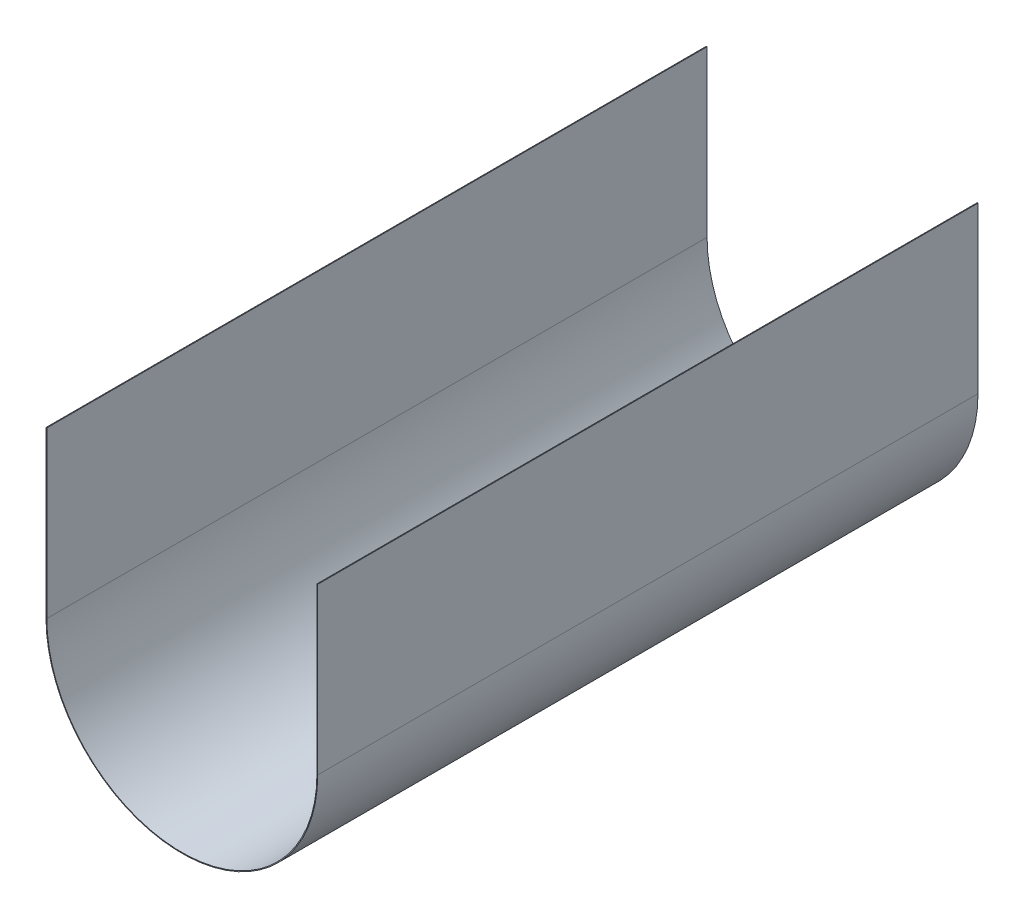
ISO-10303-21;
HEADER;
FILE_DESCRIPTION(('STEP AP214'),'2;1');
FILE_NAME('part.step','',(''),(''),'','','');
FILE_SCHEMA(('AUTOMOTIVE_DESIGN { 1 0 10303 214 1 1 1 1 }'));
ENDSEC;
DATA;
#1=APPLICATION_CONTEXT('core data for automotive mechanical design processes');
#2=APPLICATION_PROTOCOL_DEFINITION('international standard','automotive_design',2000,#1);
#3=PRODUCT_CONTEXT('',#1,'mechanical');
#4=PRODUCT('Part','Part','',(#3));
#5=PRODUCT_RELATED_PRODUCT_CATEGORY('part','',(#4));
#6=PRODUCT_DEFINITION_FORMATION('','',#4);
#7=PRODUCT_DEFINITION_CONTEXT('part definition',#1,'design');
#8=PRODUCT_DEFINITION('design','',#6,#7);
#9=PRODUCT_DEFINITION_SHAPE('','',#8);
#10=(LENGTH_UNIT() NAMED_UNIT(*) SI_UNIT(.MILLI.,.METRE.));
#11=(NAMED_UNIT(*) PLANE_ANGLE_UNIT() SI_UNIT($,.RADIAN.));
#12=(NAMED_UNIT(*) SI_UNIT($,.STERADIAN.) SOLID_ANGLE_UNIT());
#13=UNCERTAINTY_MEASURE_WITH_UNIT(LENGTH_MEASURE(1.E-05),#10,'distance_accuracy_value','');
#14=(GEOMETRIC_REPRESENTATION_CONTEXT(3) GLOBAL_UNCERTAINTY_ASSIGNED_CONTEXT((#13)) GLOBAL_UNIT_ASSIGNED_CONTEXT((#10,
#11,#12)) REPRESENTATION_CONTEXT('',''));
#15=CARTESIAN_POINT('',(0.,0.,0.));
#16=DIRECTION('',(0.,0.,1.));
#17=DIRECTION('',(1.,0.,0.));
#18=AXIS2_PLACEMENT_3D('',#15,#16,#17);
#19=CARTESIAN_POINT('',(-344.9,0.,1676.4));
#20=DIRECTION('',(-1.,0.,0.));
#21=DIRECTION('',(0.,0.,1.));
#22=AXIS2_PLACEMENT_3D('',#19,#20,#21);
#23=PLANE('',#22);
#24=DIRECTION('',(0.,1.,0.));
#25=VECTOR('',#24,1.);
#26=CARTESIAN_POINT('',(-344.9,0.,0.));
#27=LINE('',#26,#25);
#28=CARTESIAN_POINT('',(-344.9,0.,0.));
#29=VERTEX_POINT('',#28);
#30=CARTESIAN_POINT('',(-344.9,419.1,0.));
#31=VERTEX_POINT('',#30);
#32=EDGE_CURVE('E133',#29,#31,#27,.T.);
#33=ORIENTED_EDGE('',*,*,#32,.F.);
#34=DIRECTION('',(0.,0.,-1.));
#35=VECTOR('',#34,1.);
#36=CARTESIAN_POINT('',(-344.9,0.,1676.4));
#37=LINE('',#36,#35);
#38=CARTESIAN_POINT('',(-344.9,0.,1676.4));
#39=VERTEX_POINT('',#38);
#40=EDGE_CURVE('E11',#39,#29,#37,.T.);
#41=ORIENTED_EDGE('',*,*,#40,.F.);
#42=DIRECTION('',(0.,1.,0.));
#43=VECTOR('',#42,1.);
#44=CARTESIAN_POINT('',(-344.9,0.,1676.4));
#45=LINE('',#44,#43);
#46=CARTESIAN_POINT('',(-344.9,419.1,1676.4));
#47=VERTEX_POINT('',#46);
#48=EDGE_CURVE('E151',#39,#47,#45,.T.);
#49=ORIENTED_EDGE('',*,*,#48,.T.);
#50=DIRECTION('',(0.,0.,-1.));
#51=VECTOR('',#50,1.);
#52=CARTESIAN_POINT('',(-344.9,419.1,1676.4));
#53=LINE('',#52,#51);
#54=EDGE_CURVE('E88',#47,#31,#53,.T.);
#55=ORIENTED_EDGE('',*,*,#54,.T.);
#56=EDGE_LOOP('',(#33,#41,#49,#55));
#57=FACE_BOUND('',#56,.T.);
#58=ADVANCED_FACE('F38',(#57),#23,.T.);
#59=CARTESIAN_POINT('',(0.,0.,1676.4));
#60=DIRECTION('',(0.,0.,-1.));
#61=DIRECTION('',(-1.,0.,0.));
#62=AXIS2_PLACEMENT_3D('',#59,#60,#61);
#63=CYLINDRICAL_SURFACE('',#62,344.9);
#64=CARTESIAN_POINT('',(0.,0.,0.));
#65=DIRECTION('',(0.,0.,1.));
#66=DIRECTION('',(1.,0.,0.));
#67=AXIS2_PLACEMENT_3D('',#64,#65,#66);
#68=CIRCLE('',#67,344.9);
#69=CARTESIAN_POINT('',(344.9,0.,0.));
#70=VERTEX_POINT('',#69);
#71=EDGE_CURVE('E136',#29,#70,#68,.T.);
#72=ORIENTED_EDGE('',*,*,#71,.T.);
#73=DIRECTION('',(0.,0.,-1.));
#74=VECTOR('',#73,1.);
#75=CARTESIAN_POINT('',(344.9,0.,1676.4));
#76=LINE('',#75,#74);
#77=CARTESIAN_POINT('',(344.9,0.,1676.4));
#78=VERTEX_POINT('',#77);
#79=EDGE_CURVE('E46',#78,#70,#76,.T.);
#80=ORIENTED_EDGE('',*,*,#79,.F.);
#81=CARTESIAN_POINT('',(0.,0.,1676.4));
#82=DIRECTION('',(0.,0.,1.));
#83=DIRECTION('',(1.,0.,0.));
#84=AXIS2_PLACEMENT_3D('',#81,#82,#83);
#85=CIRCLE('',#84,344.9);
#86=EDGE_CURVE('E175',#39,#78,#85,.T.);
#87=ORIENTED_EDGE('',*,*,#86,.F.);
#88=ORIENTED_EDGE('',*,*,#40,.T.);
#89=EDGE_LOOP('',(#72,#80,#87,#88));
#90=FACE_BOUND('',#89,.T.);
#91=ADVANCED_FACE('F179',(#90),#63,.T.);
#92=CARTESIAN_POINT('',(344.9,0.,1676.4));
#93=DIRECTION('',(-1.,0.,0.));
#94=DIRECTION('',(0.,0.,1.));
#95=AXIS2_PLACEMENT_3D('',#92,#93,#94);
#96=PLANE('',#95);
#97=DIRECTION('',(0.,1.,0.));
#98=VECTOR('',#97,1.);
#99=CARTESIAN_POINT('',(344.9,0.,0.));
#100=LINE('',#99,#98);
#101=CARTESIAN_POINT('',(344.9,419.1,0.));
#102=VERTEX_POINT('',#101);
#103=EDGE_CURVE('E138',#70,#102,#100,.T.);
#104=ORIENTED_EDGE('',*,*,#103,.T.);
#105=DIRECTION('',(0.,0.,-1.));
#106=VECTOR('',#105,1.);
#107=CARTESIAN_POINT('',(344.9,419.1,1676.4));
#108=LINE('',#107,#106);
#109=CARTESIAN_POINT('',(344.9,419.1,1676.4));
#110=VERTEX_POINT('',#109);
#111=EDGE_CURVE('E157',#110,#102,#108,.T.);
#112=ORIENTED_EDGE('',*,*,#111,.F.);
#113=DIRECTION('',(0.,1.,0.));
#114=VECTOR('',#113,1.);
#115=CARTESIAN_POINT('',(344.9,0.,1676.4));
#116=LINE('',#115,#114);
#117=EDGE_CURVE('E165',#78,#110,#116,.T.);
#118=ORIENTED_EDGE('',*,*,#117,.F.);
#119=ORIENTED_EDGE('',*,*,#79,.T.);
#120=EDGE_LOOP('',(#104,#112,#118,#119));
#121=FACE_BOUND('',#120,.T.);
#122=ADVANCED_FACE('F163',(#121),#96,.F.);
#123=CARTESIAN_POINT('',(0.,419.1,1676.4));
#124=DIRECTION('',(0.,1.,0.));
#125=DIRECTION('',(0.,0.,1.));
#126=AXIS2_PLACEMENT_3D('',#123,#124,#125);
#127=PLANE('',#126);
#128=DIRECTION('',(1.,0.,0.));
#129=VECTOR('',#128,1.);
#130=CARTESIAN_POINT('',(0.,419.1,0.));
#131=LINE('',#130,#129);
#132=CARTESIAN_POINT('',(342.9,419.1,0.));
#133=VERTEX_POINT('',#132);
#134=EDGE_CURVE('E141',#133,#102,#131,.T.);
#135=ORIENTED_EDGE('',*,*,#134,.F.);
#136=DIRECTION('',(0.,0.,-1.));
#137=VECTOR('',#136,1.);
#138=CARTESIAN_POINT('',(342.9,419.1,1676.4));
#139=LINE('',#138,#137);
#140=CARTESIAN_POINT('',(342.9,419.1,1676.4));
#141=VERTEX_POINT('',#140);
#142=EDGE_CURVE('E155',#141,#133,#139,.T.);
#143=ORIENTED_EDGE('',*,*,#142,.F.);
#144=DIRECTION('',(1.,0.,0.));
#145=VECTOR('',#144,1.);
#146=CARTESIAN_POINT('',(0.,419.1,1676.4));
#147=LINE('',#146,#145);
#148=EDGE_CURVE('E128',#141,#110,#147,.T.);
#149=ORIENTED_EDGE('',*,*,#148,.T.);
#150=ORIENTED_EDGE('',*,*,#111,.T.);
#151=EDGE_LOOP('',(#135,#143,#149,#150));
#152=FACE_BOUND('',#151,.T.);
#153=ADVANCED_FACE('F173',(#152),#127,.T.);
#154=CARTESIAN_POINT('',(342.9,0.,1676.4));
#155=DIRECTION('',(-1.,0.,0.));
#156=DIRECTION('',(0.,0.,1.));
#157=AXIS2_PLACEMENT_3D('',#154,#155,#156);
#158=PLANE('',#157);
#159=DIRECTION('',(0.,1.,0.));
#160=VECTOR('',#159,1.);
#161=CARTESIAN_POINT('',(342.9,0.,0.));
#162=LINE('',#161,#160);
#163=CARTESIAN_POINT('',(342.9,0.,0.));
#164=VERTEX_POINT('',#163);
#165=EDGE_CURVE('E144',#164,#133,#162,.T.);
#166=ORIENTED_EDGE('',*,*,#165,.F.);
#167=DIRECTION('',(0.,0.,-1.));
#168=VECTOR('',#167,1.);
#169=CARTESIAN_POINT('',(342.9,0.,1676.4));
#170=LINE('',#169,#168);
#171=CARTESIAN_POINT('',(342.9,0.,1676.4));
#172=VERTEX_POINT('',#171);
#173=EDGE_CURVE('E116',#172,#164,#170,.T.);
#174=ORIENTED_EDGE('',*,*,#173,.F.);
#175=DIRECTION('',(0.,1.,0.));
#176=VECTOR('',#175,1.);
#177=CARTESIAN_POINT('',(342.9,0.,1676.4));
#178=LINE('',#177,#176);
#179=EDGE_CURVE('E126',#172,#141,#178,.T.);
#180=ORIENTED_EDGE('',*,*,#179,.T.);
#181=ORIENTED_EDGE('',*,*,#142,.T.);
#182=EDGE_LOOP('',(#166,#174,#180,#181));
#183=FACE_BOUND('',#182,.T.);
#184=ADVANCED_FACE('F189',(#183),#158,.T.);
#185=CARTESIAN_POINT('',(0.,0.,1676.4));
#186=DIRECTION('',(0.,0.,-1.));
#187=DIRECTION('',(-1.,0.,0.));
#188=AXIS2_PLACEMENT_3D('',#185,#186,#187);
#189=CYLINDRICAL_SURFACE('',#188,342.9);
#190=CARTESIAN_POINT('',(0.,0.,0.));
#191=DIRECTION('',(0.,0.,1.));
#192=DIRECTION('',(1.,0.,0.));
#193=AXIS2_PLACEMENT_3D('',#190,#191,#192);
#194=CIRCLE('',#193,342.9);
#195=CARTESIAN_POINT('',(-342.9,0.,0.));
#196=VERTEX_POINT('',#195);
#197=EDGE_CURVE('E115',#196,#164,#194,.T.);
#198=ORIENTED_EDGE('',*,*,#197,.F.);
#199=DIRECTION('',(0.,0.,-1.));
#200=VECTOR('',#199,1.);
#201=CARTESIAN_POINT('',(-342.9,0.,1676.4));
#202=LINE('',#201,#200);
#203=CARTESIAN_POINT('',(-342.9,0.,1676.4));
#204=VERTEX_POINT('',#203);
#205=EDGE_CURVE('E109',#204,#196,#202,.T.);
#206=ORIENTED_EDGE('',*,*,#205,.F.);
#207=CARTESIAN_POINT('',(0.,0.,1676.4));
#208=DIRECTION('',(0.,0.,1.));
#209=DIRECTION('',(1.,0.,0.));
#210=AXIS2_PLACEMENT_3D('',#207,#208,#209);
#211=CIRCLE('',#210,342.9);
#212=EDGE_CURVE('E113',#204,#172,#211,.T.);
#213=ORIENTED_EDGE('',*,*,#212,.T.);
#214=ORIENTED_EDGE('',*,*,#173,.T.);
#215=EDGE_LOOP('',(#198,#206,#213,#214));
#216=FACE_BOUND('',#215,.T.);
#217=ADVANCED_FACE('F111',(#216),#189,.F.);
#218=CARTESIAN_POINT('',(-342.9,0.,1676.4));
#219=DIRECTION('',(-1.,0.,0.));
#220=DIRECTION('',(0.,0.,1.));
#221=AXIS2_PLACEMENT_3D('',#218,#219,#220);
#222=PLANE('',#221);
#223=DIRECTION('',(0.,1.,0.));
#224=VECTOR('',#223,1.);
#225=CARTESIAN_POINT('',(-342.9,0.,0.));
#226=LINE('',#225,#224);
#227=CARTESIAN_POINT('',(-342.9,419.1,0.));
#228=VERTEX_POINT('',#227);
#229=EDGE_CURVE('E81',#196,#228,#226,.T.);
#230=ORIENTED_EDGE('',*,*,#229,.T.);
#231=DIRECTION('',(0.,0.,-1.));
#232=VECTOR('',#231,1.);
#233=CARTESIAN_POINT('',(-342.9,419.1,1676.4));
#234=LINE('',#233,#232);
#235=CARTESIAN_POINT('',(-342.9,419.1,1676.4));
#236=VERTEX_POINT('',#235);
#237=EDGE_CURVE('E117',#236,#228,#234,.T.);
#238=ORIENTED_EDGE('',*,*,#237,.F.);
#239=DIRECTION('',(0.,1.,0.));
#240=VECTOR('',#239,1.);
#241=CARTESIAN_POINT('',(-342.9,0.,1676.4));
#242=LINE('',#241,#240);
#243=EDGE_CURVE('E119',#204,#236,#242,.T.);
#244=ORIENTED_EDGE('',*,*,#243,.F.);
#245=ORIENTED_EDGE('',*,*,#205,.T.);
#246=EDGE_LOOP('',(#230,#238,#244,#245));
#247=FACE_BOUND('',#246,.T.);
#248=ADVANCED_FACE('F120',(#247),#222,.F.);
#249=CARTESIAN_POINT('',(0.,419.1,1676.4));
#250=DIRECTION('',(0.,-1.,0.));
#251=DIRECTION('',(0.,0.,-1.));
#252=AXIS2_PLACEMENT_3D('',#249,#250,#251);
#253=PLANE('',#252);
#254=DIRECTION('',(-1.,0.,0.));
#255=VECTOR('',#254,1.);
#256=CARTESIAN_POINT('',(0.,419.1,0.));
#257=LINE('',#256,#255);
#258=EDGE_CURVE('E149',#228,#31,#257,.T.);
#259=ORIENTED_EDGE('',*,*,#258,.T.);
#260=ORIENTED_EDGE('',*,*,#54,.F.);
#261=DIRECTION('',(-1.,0.,0.));
#262=VECTOR('',#261,1.);
#263=CARTESIAN_POINT('',(0.,419.1,1676.4));
#264=LINE('',#263,#262);
#265=EDGE_CURVE('E54',#236,#47,#264,.T.);
#266=ORIENTED_EDGE('',*,*,#265,.F.);
#267=ORIENTED_EDGE('',*,*,#237,.T.);
#268=EDGE_LOOP('',(#259,#260,#266,#267));
#269=FACE_BOUND('',#268,.T.);
#270=ADVANCED_FACE('F197',(#269),#253,.F.);
#271=CARTESIAN_POINT('',(0.,0.,1676.4));
#272=DIRECTION('',(0.,0.,1.));
#273=DIRECTION('',(1.,0.,0.));
#274=AXIS2_PLACEMENT_3D('',#271,#272,#273);
#275=PLANE('',#274);
#276=ORIENTED_EDGE('',*,*,#48,.F.);
#277=ORIENTED_EDGE('',*,*,#86,.T.);
#278=ORIENTED_EDGE('',*,*,#117,.T.);
#279=ORIENTED_EDGE('',*,*,#148,.F.);
#280=ORIENTED_EDGE('',*,*,#179,.F.);
#281=ORIENTED_EDGE('',*,*,#212,.F.);
#282=ORIENTED_EDGE('',*,*,#243,.T.);
#283=ORIENTED_EDGE('',*,*,#265,.T.);
#284=EDGE_LOOP('',(#276,#277,#278,#279,#280,#281,#282,#283));
#285=FACE_BOUND('',#284,.T.);
#286=ADVANCED_FACE('F123',(#285),#275,.T.);
#287=CARTESIAN_POINT('',(0.,0.,0.));
#288=DIRECTION('',(0.,0.,1.));
#289=DIRECTION('',(1.,0.,0.));
#290=AXIS2_PLACEMENT_3D('',#287,#288,#289);
#291=PLANE('',#290);
#292=ORIENTED_EDGE('',*,*,#32,.T.);
#293=ORIENTED_EDGE('',*,*,#258,.F.);
#294=ORIENTED_EDGE('',*,*,#229,.F.);
#295=ORIENTED_EDGE('',*,*,#197,.T.);
#296=ORIENTED_EDGE('',*,*,#165,.T.);
#297=ORIENTED_EDGE('',*,*,#134,.T.);
#298=ORIENTED_EDGE('',*,*,#103,.F.);
#299=ORIENTED_EDGE('',*,*,#71,.F.);
#300=EDGE_LOOP('',(#292,#293,#294,#295,#296,#297,#298,#299));
#301=FACE_BOUND('',#300,.T.);
#302=ADVANCED_FACE('F169',(#301),#291,.F.);
#303=CLOSED_SHELL('',(#58,#91,#122,#153,#184,#217,#248,#270,#286,#302));
#304=MANIFOLD_SOLID_BREP('B2',#303);
#305=ADVANCED_BREP_SHAPE_REPRESENTATION('',(#18,#304),#14);
#306=SHAPE_DEFINITION_REPRESENTATION(#9,#305);
ENDSEC;
END-ISO-10303-21;
